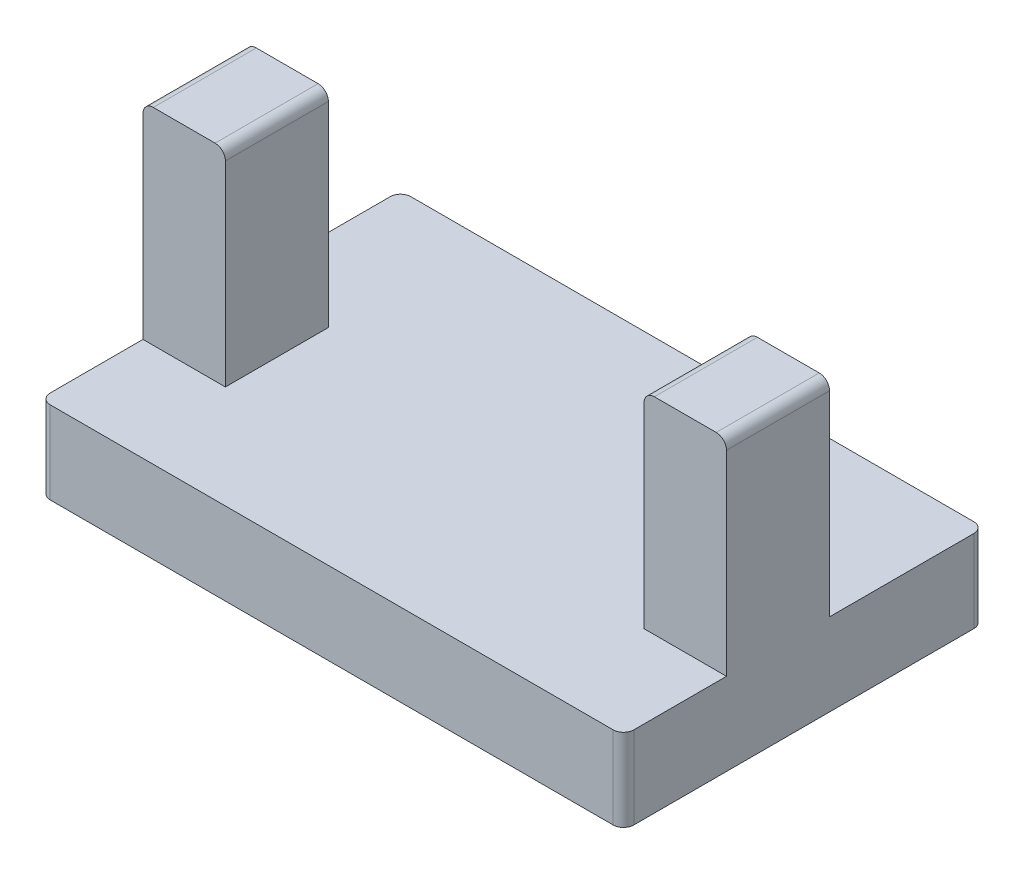
ISO-10303-21;
HEADER;
FILE_DESCRIPTION(('STEP AP214'),'2;1');
FILE_NAME('part.step','',(''),(''),'','','');
FILE_SCHEMA(('AUTOMOTIVE_DESIGN { 1 0 10303 214 1 1 1 1 }'));
ENDSEC;
DATA;
#1=APPLICATION_CONTEXT('core data for automotive mechanical design processes');
#2=APPLICATION_PROTOCOL_DEFINITION('international standard','automotive_design',2000,#1);
#3=PRODUCT_CONTEXT('',#1,'mechanical');
#4=PRODUCT('Part','Part','',(#3));
#5=PRODUCT_RELATED_PRODUCT_CATEGORY('part','',(#4));
#6=PRODUCT_DEFINITION_FORMATION('','',#4);
#7=PRODUCT_DEFINITION_CONTEXT('part definition',#1,'design');
#8=PRODUCT_DEFINITION('design','',#6,#7);
#9=PRODUCT_DEFINITION_SHAPE('','',#8);
#10=(LENGTH_UNIT() NAMED_UNIT(*) SI_UNIT(.MILLI.,.METRE.));
#11=(NAMED_UNIT(*) PLANE_ANGLE_UNIT() SI_UNIT($,.RADIAN.));
#12=(NAMED_UNIT(*) SI_UNIT($,.STERADIAN.) SOLID_ANGLE_UNIT());
#13=UNCERTAINTY_MEASURE_WITH_UNIT(LENGTH_MEASURE(1.E-05),#10,'distance_accuracy_value','');
#14=(GEOMETRIC_REPRESENTATION_CONTEXT(3) GLOBAL_UNCERTAINTY_ASSIGNED_CONTEXT((#13)) GLOBAL_UNIT_ASSIGNED_CONTEXT((#10,
#11,#12)) REPRESENTATION_CONTEXT('',''));
#15=CARTESIAN_POINT('',(0.,0.,0.));
#16=DIRECTION('',(0.,0.,1.));
#17=DIRECTION('',(1.,0.,0.));
#18=AXIS2_PLACEMENT_3D('',#15,#16,#17);
#19=CARTESIAN_POINT('',(0.,8.,0.));
#20=DIRECTION('',(0.,1.,0.));
#21=DIRECTION('',(0.,0.,1.));
#22=AXIS2_PLACEMENT_3D('',#19,#20,#21);
#23=PLANE('',#22);
#24=DIRECTION('',(-1.,0.,0.));
#25=VECTOR('',#24,1.);
#26=CARTESIAN_POINT('',(-28.32,8.,-17.5));
#27=LINE('',#26,#25);
#28=CARTESIAN_POINT('',(27.32,8.,-17.5));
#29=VERTEX_POINT('',#28);
#30=CARTESIAN_POINT('',(-27.32,8.,-17.5));
#31=VERTEX_POINT('',#30);
#32=EDGE_CURVE('E198',#29,#31,#27,.T.);
#33=ORIENTED_EDGE('',*,*,#32,.T.);
#34=CARTESIAN_POINT('',(-27.32,8.,-16.5));
#35=DIRECTION('',(0.,1.,0.));
#36=DIRECTION('',(0.,0.,1.));
#37=AXIS2_PLACEMENT_3D('',#34,#35,#36);
#38=CIRCLE('',#37,1.);
#39=CARTESIAN_POINT('',(-28.32,8.,-16.5));
#40=VERTEX_POINT('',#39);
#41=EDGE_CURVE('E246',#31,#40,#38,.T.);
#42=ORIENTED_EDGE('',*,*,#41,.T.);
#43=DIRECTION('',(0.,0.,1.));
#44=VECTOR('',#43,1.);
#45=CARTESIAN_POINT('',(-28.32,8.,-17.5));
#46=LINE('',#45,#44);
#47=CARTESIAN_POINT('',(-28.32,8.,-2.5));
#48=VERTEX_POINT('',#47);
#49=EDGE_CURVE('E208',#40,#48,#46,.T.);
#50=ORIENTED_EDGE('',*,*,#49,.T.);
#51=DIRECTION('',(-1.,0.,0.));
#52=VECTOR('',#51,1.);
#53=CARTESIAN_POINT('',(-28.32,8.,-2.5));
#54=LINE('',#53,#52);
#55=CARTESIAN_POINT('',(-20.32,8.,-2.5));
#56=VERTEX_POINT('',#55);
#57=EDGE_CURVE('E320',#56,#48,#54,.T.);
#58=ORIENTED_EDGE('',*,*,#57,.F.);
#59=DIRECTION('',(0.,0.,-1.));
#60=VECTOR('',#59,1.);
#61=CARTESIAN_POINT('',(-20.32,8.,7.5));
#62=LINE('',#61,#60);
#63=CARTESIAN_POINT('',(-20.32,8.,7.5));
#64=VERTEX_POINT('',#63);
#65=EDGE_CURVE('E322',#64,#56,#62,.T.);
#66=ORIENTED_EDGE('',*,*,#65,.F.);
#67=DIRECTION('',(1.,0.,0.));
#68=VECTOR('',#67,1.);
#69=CARTESIAN_POINT('',(-28.32,8.,7.5));
#70=LINE('',#69,#68);
#71=CARTESIAN_POINT('',(-28.32,8.,7.5));
#72=VERTEX_POINT('',#71);
#73=EDGE_CURVE('E178',#72,#64,#70,.T.);
#74=ORIENTED_EDGE('',*,*,#73,.F.);
#75=CARTESIAN_POINT('',(-28.32,8.,16.5));
#76=VERTEX_POINT('',#75);
#77=EDGE_CURVE('E207',#72,#76,#46,.T.);
#78=ORIENTED_EDGE('',*,*,#77,.T.);
#79=CARTESIAN_POINT('',(-27.32,8.,16.5));
#80=DIRECTION('',(0.,1.,0.));
#81=DIRECTION('',(0.,0.,1.));
#82=AXIS2_PLACEMENT_3D('',#79,#80,#81);
#83=CIRCLE('',#82,1.);
#84=CARTESIAN_POINT('',(-27.32,8.,17.5));
#85=VERTEX_POINT('',#84);
#86=EDGE_CURVE('E244',#76,#85,#83,.T.);
#87=ORIENTED_EDGE('',*,*,#86,.T.);
#88=DIRECTION('',(1.,0.,0.));
#89=VECTOR('',#88,1.);
#90=CARTESIAN_POINT('',(-28.32,8.,17.5));
#91=LINE('',#90,#89);
#92=CARTESIAN_POINT('',(27.32,8.,17.5));
#93=VERTEX_POINT('',#92);
#94=EDGE_CURVE('E210',#85,#93,#91,.T.);
#95=ORIENTED_EDGE('',*,*,#94,.T.);
#96=CARTESIAN_POINT('',(27.32,8.,16.5));
#97=DIRECTION('',(0.,1.,0.));
#98=DIRECTION('',(0.,0.,1.));
#99=AXIS2_PLACEMENT_3D('',#96,#97,#98);
#100=CIRCLE('',#99,1.);
#101=CARTESIAN_POINT('',(28.32,8.,16.5));
#102=VERTEX_POINT('',#101);
#103=EDGE_CURVE('E240',#93,#102,#100,.T.);
#104=ORIENTED_EDGE('',*,*,#103,.T.);
#105=DIRECTION('',(0.,0.,-1.));
#106=VECTOR('',#105,1.);
#107=CARTESIAN_POINT('',(28.32,8.,-17.5));
#108=LINE('',#107,#106);
#109=CARTESIAN_POINT('',(28.32,8.,7.5));
#110=VERTEX_POINT('',#109);
#111=EDGE_CURVE('E194',#102,#110,#108,.T.);
#112=ORIENTED_EDGE('',*,*,#111,.T.);
#113=DIRECTION('',(1.,0.,0.));
#114=VECTOR('',#113,1.);
#115=CARTESIAN_POINT('',(28.32,8.,7.5));
#116=LINE('',#115,#114);
#117=CARTESIAN_POINT('',(20.32,8.,7.5));
#118=VERTEX_POINT('',#117);
#119=EDGE_CURVE('E332',#118,#110,#116,.T.);
#120=ORIENTED_EDGE('',*,*,#119,.F.);
#121=DIRECTION('',(0.,0.,1.));
#122=VECTOR('',#121,1.);
#123=CARTESIAN_POINT('',(20.32,8.,7.5));
#124=LINE('',#123,#122);
#125=CARTESIAN_POINT('',(20.32,8.,-2.5));
#126=VERTEX_POINT('',#125);
#127=EDGE_CURVE('E188',#126,#118,#124,.T.);
#128=ORIENTED_EDGE('',*,*,#127,.F.);
#129=DIRECTION('',(-1.,0.,0.));
#130=VECTOR('',#129,1.);
#131=CARTESIAN_POINT('',(28.32,8.,-2.5));
#132=LINE('',#131,#130);
#133=CARTESIAN_POINT('',(28.32,8.,-2.5));
#134=VERTEX_POINT('',#133);
#135=EDGE_CURVE('E171',#134,#126,#132,.T.);
#136=ORIENTED_EDGE('',*,*,#135,.F.);
#137=CARTESIAN_POINT('',(28.32,8.,-16.5));
#138=VERTEX_POINT('',#137);
#139=EDGE_CURVE('E184',#134,#138,#108,.T.);
#140=ORIENTED_EDGE('',*,*,#139,.T.);
#141=CARTESIAN_POINT('',(27.32,8.,-16.5));
#142=DIRECTION('',(0.,1.,0.));
#143=DIRECTION('',(0.,0.,1.));
#144=AXIS2_PLACEMENT_3D('',#141,#142,#143);
#145=CIRCLE('',#144,1.);
#146=EDGE_CURVE('E242',#138,#29,#145,.T.);
#147=ORIENTED_EDGE('',*,*,#146,.T.);
#148=EDGE_LOOP('',(#33,#42,#50,#58,#66,#74,#78,#87,#95,#104,#112,#120,#128,#136,#140,#147));
#149=FACE_BOUND('',#148,.T.);
#150=ADVANCED_FACE('F32',(#149),#23,.T.);
#151=CARTESIAN_POINT('',(28.32,8.,-17.5));
#152=DIRECTION('',(-1.,0.,0.));
#153=DIRECTION('',(0.,0.,1.));
#154=AXIS2_PLACEMENT_3D('',#151,#152,#153);
#155=PLANE('',#154);
#156=DIRECTION('',(0.,0.,-1.));
#157=VECTOR('',#156,1.);
#158=CARTESIAN_POINT('',(28.32,0.,-17.5));
#159=LINE('',#158,#157);
#160=CARTESIAN_POINT('',(28.32,0.,16.5));
#161=VERTEX_POINT('',#160);
#162=CARTESIAN_POINT('',(28.32,0.,-16.5));
#163=VERTEX_POINT('',#162);
#164=EDGE_CURVE('E214',#161,#163,#159,.T.);
#165=ORIENTED_EDGE('',*,*,#164,.T.);
#166=DIRECTION('',(0.,-1.,0.));
#167=VECTOR('',#166,1.);
#168=CARTESIAN_POINT('',(28.32,8.,-16.5));
#169=LINE('',#168,#167);
#170=EDGE_CURVE('E193',#163,#138,#169,.F.);
#171=ORIENTED_EDGE('',*,*,#170,.T.);
#172=ORIENTED_EDGE('',*,*,#139,.F.);
#173=DIRECTION('',(0.,-1.,0.));
#174=VECTOR('',#173,1.);
#175=CARTESIAN_POINT('',(28.32,28.,-2.5));
#176=LINE('',#175,#174);
#177=CARTESIAN_POINT('',(28.32,27.,-2.5));
#178=VERTEX_POINT('',#177);
#179=EDGE_CURVE('E167',#178,#134,#176,.T.);
#180=ORIENTED_EDGE('',*,*,#179,.F.);
#181=DIRECTION('',(0.,0.,-1.));
#182=VECTOR('',#181,1.);
#183=CARTESIAN_POINT('',(28.32,27.,7.5));
#184=LINE('',#183,#182);
#185=CARTESIAN_POINT('',(28.32,27.,7.5));
#186=VERTEX_POINT('',#185);
#187=EDGE_CURVE('E253',#178,#186,#184,.F.);
#188=ORIENTED_EDGE('',*,*,#187,.T.);
#189=DIRECTION('',(0.,-1.,0.));
#190=VECTOR('',#189,1.);
#191=CARTESIAN_POINT('',(28.32,28.,7.5));
#192=LINE('',#191,#190);
#193=EDGE_CURVE('E329',#186,#110,#192,.T.);
#194=ORIENTED_EDGE('',*,*,#193,.T.);
#195=ORIENTED_EDGE('',*,*,#111,.F.);
#196=DIRECTION('',(0.,-1.,0.));
#197=VECTOR('',#196,1.);
#198=CARTESIAN_POINT('',(28.32,8.,16.5));
#199=LINE('',#198,#197);
#200=EDGE_CURVE('E255',#102,#161,#199,.T.);
#201=ORIENTED_EDGE('',*,*,#200,.T.);
#202=EDGE_LOOP('',(#165,#171,#172,#180,#188,#194,#195,#201));
#203=FACE_BOUND('',#202,.T.);
#204=ADVANCED_FACE('F191',(#203),#155,.F.);
#205=CARTESIAN_POINT('',(-28.32,8.,-17.5));
#206=DIRECTION('',(0.,0.,1.));
#207=DIRECTION('',(1.,0.,0.));
#208=AXIS2_PLACEMENT_3D('',#205,#206,#207);
#209=PLANE('',#208);
#210=DIRECTION('',(-1.,0.,0.));
#211=VECTOR('',#210,1.);
#212=CARTESIAN_POINT('',(-28.32,0.,-17.5));
#213=LINE('',#212,#211);
#214=CARTESIAN_POINT('',(27.32,0.,-17.5));
#215=VERTEX_POINT('',#214);
#216=CARTESIAN_POINT('',(-27.32,0.,-17.5));
#217=VERTEX_POINT('',#216);
#218=EDGE_CURVE('E216',#215,#217,#213,.T.);
#219=ORIENTED_EDGE('',*,*,#218,.T.);
#220=DIRECTION('',(0.,-1.,0.));
#221=VECTOR('',#220,1.);
#222=CARTESIAN_POINT('',(-27.32,8.,-17.5));
#223=LINE('',#222,#221);
#224=EDGE_CURVE('E238',#217,#31,#223,.F.);
#225=ORIENTED_EDGE('',*,*,#224,.T.);
#226=ORIENTED_EDGE('',*,*,#32,.F.);
#227=DIRECTION('',(0.,-1.,0.));
#228=VECTOR('',#227,1.);
#229=CARTESIAN_POINT('',(27.32,8.,-17.5));
#230=LINE('',#229,#228);
#231=EDGE_CURVE('E235',#29,#215,#230,.T.);
#232=ORIENTED_EDGE('',*,*,#231,.T.);
#233=EDGE_LOOP('',(#219,#225,#226,#232));
#234=FACE_BOUND('',#233,.T.);
#235=ADVANCED_FACE('F372',(#234),#209,.F.);
#236=CARTESIAN_POINT('',(-28.32,8.,-17.5));
#237=DIRECTION('',(1.,0.,0.));
#238=DIRECTION('',(0.,0.,-1.));
#239=AXIS2_PLACEMENT_3D('',#236,#237,#238);
#240=PLANE('',#239);
#241=ORIENTED_EDGE('',*,*,#49,.F.);
#242=DIRECTION('',(0.,-1.,0.));
#243=VECTOR('',#242,1.);
#244=CARTESIAN_POINT('',(-28.32,8.,-16.5));
#245=LINE('',#244,#243);
#246=CARTESIAN_POINT('',(-28.32,0.,-16.5));
#247=VERTEX_POINT('',#246);
#248=EDGE_CURVE('E224',#40,#247,#245,.T.);
#249=ORIENTED_EDGE('',*,*,#248,.T.);
#250=DIRECTION('',(0.,0.,1.));
#251=VECTOR('',#250,1.);
#252=CARTESIAN_POINT('',(-28.32,0.,-17.5));
#253=LINE('',#252,#251);
#254=CARTESIAN_POINT('',(-28.32,0.,16.5));
#255=VERTEX_POINT('',#254);
#256=EDGE_CURVE('E200',#247,#255,#253,.T.);
#257=ORIENTED_EDGE('',*,*,#256,.T.);
#258=DIRECTION('',(0.,-1.,0.));
#259=VECTOR('',#258,1.);
#260=CARTESIAN_POINT('',(-28.32,8.,16.5));
#261=LINE('',#260,#259);
#262=EDGE_CURVE('E222',#255,#76,#261,.F.);
#263=ORIENTED_EDGE('',*,*,#262,.T.);
#264=ORIENTED_EDGE('',*,*,#77,.F.);
#265=DIRECTION('',(0.,-1.,0.));
#266=VECTOR('',#265,1.);
#267=CARTESIAN_POINT('',(-28.32,28.,7.5));
#268=LINE('',#267,#266);
#269=CARTESIAN_POINT('',(-28.32,27.,7.5));
#270=VERTEX_POINT('',#269);
#271=EDGE_CURVE('E204',#270,#72,#268,.T.);
#272=ORIENTED_EDGE('',*,*,#271,.F.);
#273=DIRECTION('',(0.,0.,1.));
#274=VECTOR('',#273,1.);
#275=CARTESIAN_POINT('',(-28.32,27.,-17.5));
#276=LINE('',#275,#274);
#277=CARTESIAN_POINT('',(-28.32,27.,-2.5));
#278=VERTEX_POINT('',#277);
#279=EDGE_CURVE('E213',#270,#278,#276,.F.);
#280=ORIENTED_EDGE('',*,*,#279,.T.);
#281=DIRECTION('',(0.,-1.,0.));
#282=VECTOR('',#281,1.);
#283=CARTESIAN_POINT('',(-28.32,28.,-2.5));
#284=LINE('',#283,#282);
#285=EDGE_CURVE('E291',#278,#48,#284,.T.);
#286=ORIENTED_EDGE('',*,*,#285,.T.);
#287=EDGE_LOOP('',(#241,#249,#257,#263,#264,#272,#280,#286));
#288=FACE_BOUND('',#287,.T.);
#289=ADVANCED_FACE('F311',(#288),#240,.F.);
#290=CARTESIAN_POINT('',(-28.32,8.,17.5));
#291=DIRECTION('',(0.,0.,-1.));
#292=DIRECTION('',(-1.,0.,0.));
#293=AXIS2_PLACEMENT_3D('',#290,#291,#292);
#294=PLANE('',#293);
#295=ORIENTED_EDGE('',*,*,#94,.F.);
#296=DIRECTION('',(0.,-1.,0.));
#297=VECTOR('',#296,1.);
#298=CARTESIAN_POINT('',(-27.32,8.,17.5));
#299=LINE('',#298,#297);
#300=CARTESIAN_POINT('',(-27.32,0.,17.5));
#301=VERTEX_POINT('',#300);
#302=EDGE_CURVE('E250',#85,#301,#299,.T.);
#303=ORIENTED_EDGE('',*,*,#302,.T.);
#304=DIRECTION('',(1.,0.,0.));
#305=VECTOR('',#304,1.);
#306=CARTESIAN_POINT('',(-28.32,0.,17.5));
#307=LINE('',#306,#305);
#308=CARTESIAN_POINT('',(27.32,0.,17.5));
#309=VERTEX_POINT('',#308);
#310=EDGE_CURVE('E195',#301,#309,#307,.T.);
#311=ORIENTED_EDGE('',*,*,#310,.T.);
#312=DIRECTION('',(0.,-1.,0.));
#313=VECTOR('',#312,1.);
#314=CARTESIAN_POINT('',(27.32,8.,17.5));
#315=LINE('',#314,#313);
#316=EDGE_CURVE('E248',#309,#93,#315,.F.);
#317=ORIENTED_EDGE('',*,*,#316,.T.);
#318=EDGE_LOOP('',(#295,#303,#311,#317));
#319=FACE_BOUND('',#318,.T.);
#320=ADVANCED_FACE('F380',(#319),#294,.F.);
#321=CARTESIAN_POINT('',(0.,0.,0.));
#322=DIRECTION('',(0.,1.,0.));
#323=DIRECTION('',(0.,0.,1.));
#324=AXIS2_PLACEMENT_3D('',#321,#322,#323);
#325=PLANE('',#324);
#326=ORIENTED_EDGE('',*,*,#256,.F.);
#327=CARTESIAN_POINT('',(-27.32,0.,-16.5));
#328=DIRECTION('',(0.,1.,0.));
#329=DIRECTION('',(0.,0.,1.));
#330=AXIS2_PLACEMENT_3D('',#327,#328,#329);
#331=CIRCLE('',#330,1.);
#332=EDGE_CURVE('E233',#247,#217,#331,.F.);
#333=ORIENTED_EDGE('',*,*,#332,.T.);
#334=ORIENTED_EDGE('',*,*,#218,.F.);
#335=CARTESIAN_POINT('',(27.32,0.,-16.5));
#336=DIRECTION('',(0.,1.,0.));
#337=DIRECTION('',(0.,0.,1.));
#338=AXIS2_PLACEMENT_3D('',#335,#336,#337);
#339=CIRCLE('',#338,1.);
#340=EDGE_CURVE('E229',#215,#163,#339,.F.);
#341=ORIENTED_EDGE('',*,*,#340,.T.);
#342=ORIENTED_EDGE('',*,*,#164,.F.);
#343=CARTESIAN_POINT('',(27.32,0.,16.5));
#344=DIRECTION('',(0.,1.,0.));
#345=DIRECTION('',(0.,0.,1.));
#346=AXIS2_PLACEMENT_3D('',#343,#344,#345);
#347=CIRCLE('',#346,1.);
#348=EDGE_CURVE('E227',#161,#309,#347,.F.);
#349=ORIENTED_EDGE('',*,*,#348,.T.);
#350=ORIENTED_EDGE('',*,*,#310,.F.);
#351=CARTESIAN_POINT('',(-27.32,0.,16.5));
#352=DIRECTION('',(0.,1.,0.));
#353=DIRECTION('',(0.,0.,1.));
#354=AXIS2_PLACEMENT_3D('',#351,#352,#353);
#355=CIRCLE('',#354,1.);
#356=EDGE_CURVE('E231',#301,#255,#355,.F.);
#357=ORIENTED_EDGE('',*,*,#356,.T.);
#358=EDGE_LOOP('',(#326,#333,#334,#341,#342,#349,#350,#357));
#359=FACE_BOUND('',#358,.T.);
#360=ADVANCED_FACE('F377',(#359),#325,.F.);
#361=CARTESIAN_POINT('',(-28.32,28.,7.5));
#362=DIRECTION('',(0.,0.,-1.));
#363=DIRECTION('',(-1.,0.,0.));
#364=AXIS2_PLACEMENT_3D('',#361,#362,#363);
#365=PLANE('',#364);
#366=DIRECTION('',(1.,0.,0.));
#367=VECTOR('',#366,1.);
#368=CARTESIAN_POINT('',(-28.32,28.,7.5));
#369=LINE('',#368,#367);
#370=CARTESIAN_POINT('',(-27.32,28.,7.5));
#371=VERTEX_POINT('',#370);
#372=CARTESIAN_POINT('',(-21.32,28.,7.5));
#373=VERTEX_POINT('',#372);
#374=EDGE_CURVE('E300',#371,#373,#369,.T.);
#375=ORIENTED_EDGE('',*,*,#374,.F.);
#376=CARTESIAN_POINT('',(-27.32,27.,7.5));
#377=DIRECTION('',(0.,0.,-1.));
#378=DIRECTION('',(-1.,0.,0.));
#379=AXIS2_PLACEMENT_3D('',#376,#377,#378);
#380=CIRCLE('',#379,1.);
#381=EDGE_CURVE('E282',#371,#270,#380,.F.);
#382=ORIENTED_EDGE('',*,*,#381,.T.);
#383=ORIENTED_EDGE('',*,*,#271,.T.);
#384=ORIENTED_EDGE('',*,*,#73,.T.);
#385=DIRECTION('',(0.,-1.,0.));
#386=VECTOR('',#385,1.);
#387=CARTESIAN_POINT('',(-20.32,28.,7.5));
#388=LINE('',#387,#386);
#389=CARTESIAN_POINT('',(-20.32,27.,7.5));
#390=VERTEX_POINT('',#389);
#391=EDGE_CURVE('E313',#390,#64,#388,.T.);
#392=ORIENTED_EDGE('',*,*,#391,.F.);
#393=CARTESIAN_POINT('',(-21.32,27.,7.5));
#394=DIRECTION('',(0.,0.,-1.));
#395=DIRECTION('',(-1.,0.,0.));
#396=AXIS2_PLACEMENT_3D('',#393,#394,#395);
#397=CIRCLE('',#396,1.);
#398=EDGE_CURVE('E280',#390,#373,#397,.F.);
#399=ORIENTED_EDGE('',*,*,#398,.T.);
#400=EDGE_LOOP('',(#375,#382,#383,#384,#392,#399));
#401=FACE_BOUND('',#400,.T.);
#402=ADVANCED_FACE('F305',(#401),#365,.F.);
#403=CARTESIAN_POINT('',(-20.32,28.,7.5));
#404=DIRECTION('',(-1.,0.,0.));
#405=DIRECTION('',(0.,0.,1.));
#406=AXIS2_PLACEMENT_3D('',#403,#404,#405);
#407=PLANE('',#406);
#408=DIRECTION('',(0.,-1.,0.));
#409=VECTOR('',#408,1.);
#410=CARTESIAN_POINT('',(-20.32,28.,-2.5));
#411=LINE('',#410,#409);
#412=CARTESIAN_POINT('',(-20.32,27.,-2.5));
#413=VERTEX_POINT('',#412);
#414=EDGE_CURVE('E314',#413,#56,#411,.T.);
#415=ORIENTED_EDGE('',*,*,#414,.F.);
#416=DIRECTION('',(0.,0.,-1.));
#417=VECTOR('',#416,1.);
#418=CARTESIAN_POINT('',(-20.32,27.,7.5));
#419=LINE('',#418,#417);
#420=EDGE_CURVE('E11',#413,#390,#419,.F.);
#421=ORIENTED_EDGE('',*,*,#420,.T.);
#422=ORIENTED_EDGE('',*,*,#391,.T.);
#423=ORIENTED_EDGE('',*,*,#65,.T.);
#424=EDGE_LOOP('',(#415,#421,#422,#423));
#425=FACE_BOUND('',#424,.T.);
#426=ADVANCED_FACE('F513',(#425),#407,.F.);
#427=CARTESIAN_POINT('',(-28.32,28.,-2.5));
#428=DIRECTION('',(0.,0.,1.));
#429=DIRECTION('',(1.,0.,0.));
#430=AXIS2_PLACEMENT_3D('',#427,#428,#429);
#431=PLANE('',#430);
#432=ORIENTED_EDGE('',*,*,#285,.F.);
#433=CARTESIAN_POINT('',(-27.32,27.,-2.5));
#434=DIRECTION('',(0.,0.,1.));
#435=DIRECTION('',(1.,0.,0.));
#436=AXIS2_PLACEMENT_3D('',#433,#434,#435);
#437=CIRCLE('',#436,1.);
#438=CARTESIAN_POINT('',(-27.32,28.,-2.5));
#439=VERTEX_POINT('',#438);
#440=EDGE_CURVE('E40',#278,#439,#437,.F.);
#441=ORIENTED_EDGE('',*,*,#440,.T.);
#442=DIRECTION('',(-1.,0.,0.));
#443=VECTOR('',#442,1.);
#444=CARTESIAN_POINT('',(-28.32,28.,-2.5));
#445=LINE('',#444,#443);
#446=CARTESIAN_POINT('',(-21.32,28.,-2.5));
#447=VERTEX_POINT('',#446);
#448=EDGE_CURVE('E288',#447,#439,#445,.T.);
#449=ORIENTED_EDGE('',*,*,#448,.F.);
#450=CARTESIAN_POINT('',(-21.32,27.,-2.5));
#451=DIRECTION('',(0.,0.,1.));
#452=DIRECTION('',(1.,0.,0.));
#453=AXIS2_PLACEMENT_3D('',#450,#451,#452);
#454=CIRCLE('',#453,1.);
#455=EDGE_CURVE('E47',#447,#413,#454,.F.);
#456=ORIENTED_EDGE('',*,*,#455,.T.);
#457=ORIENTED_EDGE('',*,*,#414,.T.);
#458=ORIENTED_EDGE('',*,*,#57,.T.);
#459=EDGE_LOOP('',(#432,#441,#449,#456,#457,#458));
#460=FACE_BOUND('',#459,.T.);
#461=ADVANCED_FACE('F287',(#460),#431,.F.);
#462=CARTESIAN_POINT('',(0.,28.,0.));
#463=DIRECTION('',(0.,-1.,0.));
#464=DIRECTION('',(0.,0.,-1.));
#465=AXIS2_PLACEMENT_3D('',#462,#463,#464);
#466=PLANE('',#465);
#467=ORIENTED_EDGE('',*,*,#448,.T.);
#468=DIRECTION('',(0.,0.,1.));
#469=VECTOR('',#468,1.);
#470=CARTESIAN_POINT('',(-27.32,28.,0.));
#471=LINE('',#470,#469);
#472=EDGE_CURVE('E277',#439,#371,#471,.T.);
#473=ORIENTED_EDGE('',*,*,#472,.T.);
#474=ORIENTED_EDGE('',*,*,#374,.T.);
#475=DIRECTION('',(0.,0.,-1.));
#476=VECTOR('',#475,1.);
#477=CARTESIAN_POINT('',(-21.32,28.,0.));
#478=LINE('',#477,#476);
#479=EDGE_CURVE('E274',#373,#447,#478,.T.);
#480=ORIENTED_EDGE('',*,*,#479,.T.);
#481=EDGE_LOOP('',(#467,#473,#474,#480));
#482=FACE_BOUND('',#481,.T.);
#483=ADVANCED_FACE('F296',(#482),#466,.F.);
#484=CARTESIAN_POINT('',(28.32,28.,-2.5));
#485=DIRECTION('',(0.,0.,1.));
#486=DIRECTION('',(1.,0.,0.));
#487=AXIS2_PLACEMENT_3D('',#484,#485,#486);
#488=PLANE('',#487);
#489=DIRECTION('',(0.,-1.,0.));
#490=VECTOR('',#489,1.);
#491=CARTESIAN_POINT('',(20.32,28.,-2.5));
#492=LINE('',#491,#490);
#493=CARTESIAN_POINT('',(20.32,27.,-2.5));
#494=VERTEX_POINT('',#493);
#495=EDGE_CURVE('E179',#494,#126,#492,.T.);
#496=ORIENTED_EDGE('',*,*,#495,.F.);
#497=CARTESIAN_POINT('',(21.32,27.,-2.5));
#498=DIRECTION('',(0.,0.,1.));
#499=DIRECTION('',(1.,0.,0.));
#500=AXIS2_PLACEMENT_3D('',#497,#498,#499);
#501=CIRCLE('',#500,1.);
#502=CARTESIAN_POINT('',(21.32,28.,-2.5));
#503=VERTEX_POINT('',#502);
#504=EDGE_CURVE('E272',#494,#503,#501,.F.);
#505=ORIENTED_EDGE('',*,*,#504,.T.);
#506=DIRECTION('',(-1.,0.,0.));
#507=VECTOR('',#506,1.);
#508=CARTESIAN_POINT('',(28.32,28.,-2.5));
#509=LINE('',#508,#507);
#510=CARTESIAN_POINT('',(27.32,28.,-2.5));
#511=VERTEX_POINT('',#510);
#512=EDGE_CURVE('E335',#511,#503,#509,.T.);
#513=ORIENTED_EDGE('',*,*,#512,.F.);
#514=CARTESIAN_POINT('',(27.32,27.,-2.5));
#515=DIRECTION('',(0.,0.,1.));
#516=DIRECTION('',(1.,0.,0.));
#517=AXIS2_PLACEMENT_3D('',#514,#515,#516);
#518=CIRCLE('',#517,1.);
#519=EDGE_CURVE('E174',#511,#178,#518,.F.);
#520=ORIENTED_EDGE('',*,*,#519,.T.);
#521=ORIENTED_EDGE('',*,*,#179,.T.);
#522=ORIENTED_EDGE('',*,*,#135,.T.);
#523=EDGE_LOOP('',(#496,#505,#513,#520,#521,#522));
#524=FACE_BOUND('',#523,.T.);
#525=ADVANCED_FACE('F170',(#524),#488,.F.);
#526=CARTESIAN_POINT('',(20.32,28.,7.5));
#527=DIRECTION('',(1.,0.,0.));
#528=DIRECTION('',(0.,0.,-1.));
#529=AXIS2_PLACEMENT_3D('',#526,#527,#528);
#530=PLANE('',#529);
#531=DIRECTION('',(0.,-1.,0.));
#532=VECTOR('',#531,1.);
#533=CARTESIAN_POINT('',(20.32,28.,7.5));
#534=LINE('',#533,#532);
#535=CARTESIAN_POINT('',(20.32,27.,7.5));
#536=VERTEX_POINT('',#535);
#537=EDGE_CURVE('E327',#536,#118,#534,.T.);
#538=ORIENTED_EDGE('',*,*,#537,.F.);
#539=DIRECTION('',(0.,0.,1.));
#540=VECTOR('',#539,1.);
#541=CARTESIAN_POINT('',(20.32,27.,-2.5));
#542=LINE('',#541,#540);
#543=EDGE_CURVE('E269',#536,#494,#542,.F.);
#544=ORIENTED_EDGE('',*,*,#543,.T.);
#545=ORIENTED_EDGE('',*,*,#495,.T.);
#546=ORIENTED_EDGE('',*,*,#127,.T.);
#547=EDGE_LOOP('',(#538,#544,#545,#546));
#548=FACE_BOUND('',#547,.T.);
#549=ADVANCED_FACE('F353',(#548),#530,.F.);
#550=CARTESIAN_POINT('',(28.32,28.,7.5));
#551=DIRECTION('',(0.,0.,-1.));
#552=DIRECTION('',(-1.,0.,0.));
#553=AXIS2_PLACEMENT_3D('',#550,#551,#552);
#554=PLANE('',#553);
#555=DIRECTION('',(1.,0.,0.));
#556=VECTOR('',#555,1.);
#557=CARTESIAN_POINT('',(28.32,28.,7.5));
#558=LINE('',#557,#556);
#559=CARTESIAN_POINT('',(21.32,28.,7.5));
#560=VERTEX_POINT('',#559);
#561=CARTESIAN_POINT('',(27.32,28.,7.5));
#562=VERTEX_POINT('',#561);
#563=EDGE_CURVE('E331',#560,#562,#558,.T.);
#564=ORIENTED_EDGE('',*,*,#563,.F.);
#565=CARTESIAN_POINT('',(21.32,27.,7.5));
#566=DIRECTION('',(0.,0.,-1.));
#567=DIRECTION('',(-1.,0.,0.));
#568=AXIS2_PLACEMENT_3D('',#565,#566,#567);
#569=CIRCLE('',#568,1.);
#570=EDGE_CURVE('E267',#560,#536,#569,.F.);
#571=ORIENTED_EDGE('',*,*,#570,.T.);
#572=ORIENTED_EDGE('',*,*,#537,.T.);
#573=ORIENTED_EDGE('',*,*,#119,.T.);
#574=ORIENTED_EDGE('',*,*,#193,.F.);
#575=CARTESIAN_POINT('',(27.32,27.,7.5));
#576=DIRECTION('',(0.,0.,-1.));
#577=DIRECTION('',(-1.,0.,0.));
#578=AXIS2_PLACEMENT_3D('',#575,#576,#577);
#579=CIRCLE('',#578,1.);
#580=EDGE_CURVE('E265',#186,#562,#579,.F.);
#581=ORIENTED_EDGE('',*,*,#580,.T.);
#582=EDGE_LOOP('',(#564,#571,#572,#573,#574,#581));
#583=FACE_BOUND('',#582,.T.);
#584=ADVANCED_FACE('F351',(#583),#554,.F.);
#585=CARTESIAN_POINT('',(0.,28.,0.));
#586=DIRECTION('',(0.,1.,0.));
#587=DIRECTION('',(0.,0.,1.));
#588=AXIS2_PLACEMENT_3D('',#585,#586,#587);
#589=PLANE('',#588);
#590=ORIENTED_EDGE('',*,*,#512,.T.);
#591=DIRECTION('',(0.,0.,1.));
#592=VECTOR('',#591,1.);
#593=CARTESIAN_POINT('',(21.32,28.,7.5));
#594=LINE('',#593,#592);
#595=EDGE_CURVE('E262',#503,#560,#594,.T.);
#596=ORIENTED_EDGE('',*,*,#595,.T.);
#597=ORIENTED_EDGE('',*,*,#563,.T.);
#598=DIRECTION('',(0.,0.,-1.));
#599=VECTOR('',#598,1.);
#600=CARTESIAN_POINT('',(27.32,28.,-2.5));
#601=LINE('',#600,#599);
#602=EDGE_CURVE('E259',#562,#511,#601,.T.);
#603=ORIENTED_EDGE('',*,*,#602,.T.);
#604=EDGE_LOOP('',(#590,#596,#597,#603));
#605=FACE_BOUND('',#604,.T.);
#606=ADVANCED_FACE('F342',(#605),#589,.T.);
#607=CARTESIAN_POINT('',(-27.32,8.,-16.5));
#608=DIRECTION('',(0.,-1.,0.));
#609=DIRECTION('',(0.,0.,-1.));
#610=AXIS2_PLACEMENT_3D('',#607,#608,#609);
#611=CYLINDRICAL_SURFACE('',#610,1.);
#612=ORIENTED_EDGE('',*,*,#41,.F.);
#613=ORIENTED_EDGE('',*,*,#224,.F.);
#614=ORIENTED_EDGE('',*,*,#332,.F.);
#615=ORIENTED_EDGE('',*,*,#248,.F.);
#616=EDGE_LOOP('',(#612,#613,#614,#615));
#617=FACE_BOUND('',#616,.T.);
#618=ADVANCED_FACE('F390',(#617),#611,.T.);
#619=CARTESIAN_POINT('',(-27.32,8.,16.5));
#620=DIRECTION('',(0.,-1.,0.));
#621=DIRECTION('',(0.,0.,-1.));
#622=AXIS2_PLACEMENT_3D('',#619,#620,#621);
#623=CYLINDRICAL_SURFACE('',#622,1.);
#624=ORIENTED_EDGE('',*,*,#86,.F.);
#625=ORIENTED_EDGE('',*,*,#262,.F.);
#626=ORIENTED_EDGE('',*,*,#356,.F.);
#627=ORIENTED_EDGE('',*,*,#302,.F.);
#628=EDGE_LOOP('',(#624,#625,#626,#627));
#629=FACE_BOUND('',#628,.T.);
#630=ADVANCED_FACE('F393',(#629),#623,.T.);
#631=CARTESIAN_POINT('',(27.32,8.,-16.5));
#632=DIRECTION('',(0.,-1.,0.));
#633=DIRECTION('',(0.,0.,-1.));
#634=AXIS2_PLACEMENT_3D('',#631,#632,#633);
#635=CYLINDRICAL_SURFACE('',#634,1.);
#636=ORIENTED_EDGE('',*,*,#146,.F.);
#637=ORIENTED_EDGE('',*,*,#170,.F.);
#638=ORIENTED_EDGE('',*,*,#340,.F.);
#639=ORIENTED_EDGE('',*,*,#231,.F.);
#640=EDGE_LOOP('',(#636,#637,#638,#639));
#641=FACE_BOUND('',#640,.T.);
#642=ADVANCED_FACE('F397',(#641),#635,.T.);
#643=CARTESIAN_POINT('',(27.32,8.,16.5));
#644=DIRECTION('',(0.,-1.,0.));
#645=DIRECTION('',(0.,0.,-1.));
#646=AXIS2_PLACEMENT_3D('',#643,#644,#645);
#647=CYLINDRICAL_SURFACE('',#646,1.);
#648=ORIENTED_EDGE('',*,*,#103,.F.);
#649=ORIENTED_EDGE('',*,*,#316,.F.);
#650=ORIENTED_EDGE('',*,*,#348,.F.);
#651=ORIENTED_EDGE('',*,*,#200,.F.);
#652=EDGE_LOOP('',(#648,#649,#650,#651));
#653=FACE_BOUND('',#652,.T.);
#654=ADVANCED_FACE('F365',(#653),#647,.T.);
#655=CARTESIAN_POINT('',(21.32,27.,0.));
#656=DIRECTION('',(0.,0.,-1.));
#657=DIRECTION('',(-1.,0.,0.));
#658=AXIS2_PLACEMENT_3D('',#655,#656,#657);
#659=CYLINDRICAL_SURFACE('',#658,1.);
#660=ORIENTED_EDGE('',*,*,#504,.F.);
#661=ORIENTED_EDGE('',*,*,#543,.F.);
#662=ORIENTED_EDGE('',*,*,#570,.F.);
#663=ORIENTED_EDGE('',*,*,#595,.F.);
#664=EDGE_LOOP('',(#660,#661,#662,#663));
#665=FACE_BOUND('',#664,.T.);
#666=ADVANCED_FACE('F347',(#665),#659,.T.);
#667=CARTESIAN_POINT('',(27.32,27.,0.));
#668=DIRECTION('',(0.,0.,1.));
#669=DIRECTION('',(1.,0.,0.));
#670=AXIS2_PLACEMENT_3D('',#667,#668,#669);
#671=CYLINDRICAL_SURFACE('',#670,1.);
#672=ORIENTED_EDGE('',*,*,#580,.F.);
#673=ORIENTED_EDGE('',*,*,#187,.F.);
#674=ORIENTED_EDGE('',*,*,#519,.F.);
#675=ORIENTED_EDGE('',*,*,#602,.F.);
#676=EDGE_LOOP('',(#672,#673,#674,#675));
#677=FACE_BOUND('',#676,.T.);
#678=ADVANCED_FACE('F358',(#677),#671,.T.);
#679=CARTESIAN_POINT('',(-27.32,27.,0.));
#680=DIRECTION('',(0.,0.,1.));
#681=DIRECTION('',(1.,0.,0.));
#682=AXIS2_PLACEMENT_3D('',#679,#680,#681);
#683=CYLINDRICAL_SURFACE('',#682,1.);
#684=ORIENTED_EDGE('',*,*,#440,.F.);
#685=ORIENTED_EDGE('',*,*,#279,.F.);
#686=ORIENTED_EDGE('',*,*,#381,.F.);
#687=ORIENTED_EDGE('',*,*,#472,.F.);
#688=EDGE_LOOP('',(#684,#685,#686,#687));
#689=FACE_BOUND('',#688,.T.);
#690=ADVANCED_FACE('F302',(#689),#683,.T.);
#691=CARTESIAN_POINT('',(-21.32,27.,0.));
#692=DIRECTION('',(0.,0.,-1.));
#693=DIRECTION('',(-1.,0.,0.));
#694=AXIS2_PLACEMENT_3D('',#691,#692,#693);
#695=CYLINDRICAL_SURFACE('',#694,1.);
#696=ORIENTED_EDGE('',*,*,#398,.F.);
#697=ORIENTED_EDGE('',*,*,#420,.F.);
#698=ORIENTED_EDGE('',*,*,#455,.F.);
#699=ORIENTED_EDGE('',*,*,#479,.F.);
#700=EDGE_LOOP('',(#696,#697,#698,#699));
#701=FACE_BOUND('',#700,.T.);
#702=ADVANCED_FACE('F34',(#701),#695,.T.);
#703=CLOSED_SHELL('',(#150,#204,#235,#289,#320,#360,#402,#426,#461,#483,#525,#549,#584,#606,
#618,#630,#642,#654,#666,#678,#690,#702));
#704=MANIFOLD_SOLID_BREP('B2',#703);
#705=ADVANCED_BREP_SHAPE_REPRESENTATION('',(#18,#704),#14);
#706=SHAPE_DEFINITION_REPRESENTATION(#9,#705);
ENDSEC;
END-ISO-10303-21;
